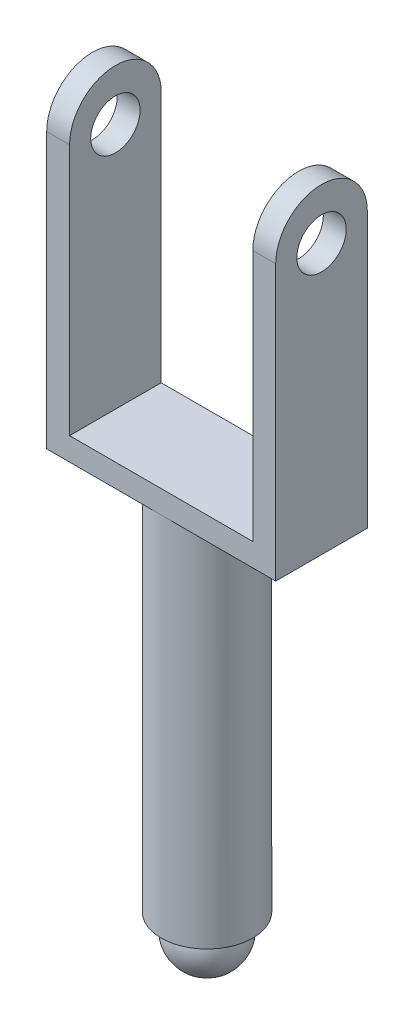
ISO-10303-21;
HEADER;
FILE_DESCRIPTION(('STEP AP214'),'2;1');
FILE_NAME('part.step','',(''),(''),'','','');
FILE_SCHEMA(('AUTOMOTIVE_DESIGN { 1 0 10303 214 1 1 1 1 }'));
ENDSEC;
DATA;
#1=APPLICATION_CONTEXT('core data for automotive mechanical design processes');
#2=APPLICATION_PROTOCOL_DEFINITION('international standard','automotive_design',2000,#1);
#3=PRODUCT_CONTEXT('',#1,'mechanical');
#4=PRODUCT('Part','Part','',(#3));
#5=PRODUCT_RELATED_PRODUCT_CATEGORY('part','',(#4));
#6=PRODUCT_DEFINITION_FORMATION('','',#4);
#7=PRODUCT_DEFINITION_CONTEXT('part definition',#1,'design');
#8=PRODUCT_DEFINITION('design','',#6,#7);
#9=PRODUCT_DEFINITION_SHAPE('','',#8);
#10=(LENGTH_UNIT() NAMED_UNIT(*) SI_UNIT(.MILLI.,.METRE.));
#11=(NAMED_UNIT(*) PLANE_ANGLE_UNIT() SI_UNIT($,.RADIAN.));
#12=(NAMED_UNIT(*) SI_UNIT($,.STERADIAN.) SOLID_ANGLE_UNIT());
#13=UNCERTAINTY_MEASURE_WITH_UNIT(LENGTH_MEASURE(1.E-05),#10,'distance_accuracy_value','');
#14=(GEOMETRIC_REPRESENTATION_CONTEXT(3) GLOBAL_UNCERTAINTY_ASSIGNED_CONTEXT((#13)) GLOBAL_UNIT_ASSIGNED_CONTEXT((#10,
#11,#12)) REPRESENTATION_CONTEXT('',''));
#15=CARTESIAN_POINT('',(0.,0.,0.));
#16=DIRECTION('',(0.,0.,1.));
#17=DIRECTION('',(1.,0.,0.));
#18=AXIS2_PLACEMENT_3D('',#15,#16,#17);
#19=CARTESIAN_POINT('',(25.,140.,0.));
#20=DIRECTION('',(1.,0.,0.));
#21=DIRECTION('',(0.,0.,-1.));
#22=AXIS2_PLACEMENT_3D('',#19,#20,#21);
#23=CYLINDRICAL_SURFACE('',#22,10.);
#24=DIRECTION('',(-1.,0.,0.));
#25=VECTOR('',#24,1.);
#26=CARTESIAN_POINT('',(25.,140.,10.));
#27=LINE('',#26,#25);
#28=CARTESIAN_POINT('',(25.,140.,10.));
#29=VERTEX_POINT('',#28);
#30=CARTESIAN_POINT('',(20.,140.,10.));
#31=VERTEX_POINT('',#30);
#32=EDGE_CURVE('E186',#29,#31,#27,.T.);
#33=ORIENTED_EDGE('',*,*,#32,.F.);
#34=CARTESIAN_POINT('',(25.,140.,0.));
#35=DIRECTION('',(-1.,0.,0.));
#36=DIRECTION('',(0.,0.,1.));
#37=AXIS2_PLACEMENT_3D('',#34,#35,#36);
#38=CIRCLE('',#37,10.);
#39=CARTESIAN_POINT('',(25.,140.,-10.));
#40=VERTEX_POINT('',#39);
#41=EDGE_CURVE('E52',#40,#29,#38,.F.);
#42=ORIENTED_EDGE('',*,*,#41,.F.);
#43=DIRECTION('',(-1.,0.,0.));
#44=VECTOR('',#43,1.);
#45=CARTESIAN_POINT('',(25.,140.,-10.));
#46=LINE('',#45,#44);
#47=CARTESIAN_POINT('',(20.,140.,-10.));
#48=VERTEX_POINT('',#47);
#49=EDGE_CURVE('E188',#48,#40,#46,.F.);
#50=ORIENTED_EDGE('',*,*,#49,.F.);
#51=CARTESIAN_POINT('',(20.,140.,0.));
#52=DIRECTION('',(1.,0.,0.));
#53=DIRECTION('',(0.,0.,-1.));
#54=AXIS2_PLACEMENT_3D('',#51,#52,#53);
#55=CIRCLE('',#54,10.);
#56=EDGE_CURVE('E45',#31,#48,#55,.F.);
#57=ORIENTED_EDGE('',*,*,#56,.F.);
#58=EDGE_LOOP('',(#33,#42,#50,#57));
#59=FACE_BOUND('',#58,.T.);
#60=ADVANCED_FACE('F37',(#59),#23,.T.);
#61=CARTESIAN_POINT('',(-20.,140.,0.));
#62=DIRECTION('',(1.,0.,0.));
#63=DIRECTION('',(0.,0.,-1.));
#64=AXIS2_PLACEMENT_3D('',#61,#62,#63);
#65=CYLINDRICAL_SURFACE('',#64,10.);
#66=DIRECTION('',(-1.,0.,0.));
#67=VECTOR('',#66,1.);
#68=CARTESIAN_POINT('',(-20.,140.,10.));
#69=LINE('',#68,#67);
#70=CARTESIAN_POINT('',(-20.,140.,10.));
#71=VERTEX_POINT('',#70);
#72=CARTESIAN_POINT('',(-25.,140.,10.));
#73=VERTEX_POINT('',#72);
#74=EDGE_CURVE('E171',#71,#73,#69,.T.);
#75=ORIENTED_EDGE('',*,*,#74,.F.);
#76=CARTESIAN_POINT('',(-20.,140.,0.));
#77=DIRECTION('',(-1.,0.,0.));
#78=DIRECTION('',(0.,0.,1.));
#79=AXIS2_PLACEMENT_3D('',#76,#77,#78);
#80=CIRCLE('',#79,10.);
#81=CARTESIAN_POINT('',(-20.,140.,-10.));
#82=VERTEX_POINT('',#81);
#83=EDGE_CURVE('E112',#82,#71,#80,.F.);
#84=ORIENTED_EDGE('',*,*,#83,.F.);
#85=DIRECTION('',(-1.,0.,0.));
#86=VECTOR('',#85,1.);
#87=CARTESIAN_POINT('',(-20.,140.,-10.));
#88=LINE('',#87,#86);
#89=CARTESIAN_POINT('',(-25.,140.,-10.));
#90=VERTEX_POINT('',#89);
#91=EDGE_CURVE('E180',#90,#82,#88,.F.);
#92=ORIENTED_EDGE('',*,*,#91,.F.);
#93=CARTESIAN_POINT('',(-25.,140.,0.));
#94=DIRECTION('',(1.,0.,0.));
#95=DIRECTION('',(0.,0.,-1.));
#96=AXIS2_PLACEMENT_3D('',#93,#94,#95);
#97=CIRCLE('',#96,10.);
#98=EDGE_CURVE('E184',#73,#90,#97,.F.);
#99=ORIENTED_EDGE('',*,*,#98,.F.);
#100=EDGE_LOOP('',(#75,#84,#92,#99));
#101=FACE_BOUND('',#100,.T.);
#102=ADVANCED_FACE('F219',(#101),#65,.T.);
#103=CARTESIAN_POINT('',(0.,0.,0.));
#104=DIRECTION('',(0.,1.,0.));
#105=DIRECTION('',(0.,0.,1.));
#106=AXIS2_PLACEMENT_3D('',#103,#104,#105);
#107=PLANE('',#106);
#108=CARTESIAN_POINT('',(0.,0.,0.));
#109=DIRECTION('',(0.,1.,0.));
#110=DIRECTION('',(0.,0.,1.));
#111=AXIS2_PLACEMENT_3D('',#108,#109,#110);
#112=CIRCLE('',#111,6.69096906430917);
#113=CARTESIAN_POINT('',(0.,0.,6.69096906430917));
#114=VERTEX_POINT('',#113);
#115=EDGE_CURVE('E11',#114,#114,#112,.F.);
#116=ORIENTED_EDGE('',*,*,#115,.F.);
#117=EDGE_LOOP('',(#116));
#118=FACE_BOUND('',#117,.T.);
#119=CARTESIAN_POINT('',(0.,0.,0.));
#120=DIRECTION('',(0.,1.,0.));
#121=DIRECTION('',(0.,0.,1.));
#122=AXIS2_PLACEMENT_3D('',#119,#120,#121);
#123=CIRCLE('',#122,10.);
#124=CARTESIAN_POINT('',(0.,0.,10.));
#125=VERTEX_POINT('',#124);
#126=EDGE_CURVE('E167',#125,#125,#123,.T.);
#127=ORIENTED_EDGE('',*,*,#126,.F.);
#128=EDGE_LOOP('',(#127));
#129=FACE_BOUND('',#128,.T.);
#130=ADVANCED_FACE('F223',(#118,#129),#107,.F.);
#131=CARTESIAN_POINT('',(0.,80.,0.));
#132=DIRECTION('',(0.,-1.,0.));
#133=DIRECTION('',(0.,0.,-1.));
#134=AXIS2_PLACEMENT_3D('',#131,#132,#133);
#135=CYLINDRICAL_SURFACE('',#134,10.);
#136=CARTESIAN_POINT('',(0.,80.,0.));
#137=DIRECTION('',(0.,1.,0.));
#138=DIRECTION('',(0.,0.,1.));
#139=AXIS2_PLACEMENT_3D('',#136,#137,#138);
#140=CIRCLE('',#139,10.);
#141=CARTESIAN_POINT('',(0.,80.,10.));
#142=VERTEX_POINT('',#141);
#143=CARTESIAN_POINT('',(0.,80.,-10.));
#144=VERTEX_POINT('',#143);
#145=EDGE_CURVE('E168',#142,#144,#140,.T.);
#146=ORIENTED_EDGE('',*,*,#145,.F.);
#147=EDGE_CURVE('E172',#144,#142,#140,.T.);
#148=ORIENTED_EDGE('',*,*,#147,.F.);
#149=EDGE_LOOP('',(#146,#148));
#150=FACE_BOUND('',#149,.T.);
#151=ORIENTED_EDGE('',*,*,#126,.T.);
#152=EDGE_LOOP('',(#151));
#153=FACE_BOUND('',#152,.T.);
#154=ADVANCED_FACE('F228',(#150,#153),#135,.T.);
#155=CARTESIAN_POINT('',(0.,80.,0.));
#156=DIRECTION('',(0.,1.,0.));
#157=DIRECTION('',(0.,0.,1.));
#158=AXIS2_PLACEMENT_3D('',#155,#156,#157);
#159=PLANE('',#158);
#160=DIRECTION('',(1.,0.,0.));
#161=VECTOR('',#160,1.);
#162=CARTESIAN_POINT('',(-25.,80.,10.));
#163=LINE('',#162,#161);
#164=CARTESIAN_POINT('',(25.,80.,10.));
#165=VERTEX_POINT('',#164);
#166=EDGE_CURVE('E155',#142,#165,#163,.T.);
#167=ORIENTED_EDGE('',*,*,#166,.F.);
#168=ORIENTED_EDGE('',*,*,#145,.T.);
#169=DIRECTION('',(-1.,0.,0.));
#170=VECTOR('',#169,1.);
#171=CARTESIAN_POINT('',(-25.,80.,-10.));
#172=LINE('',#171,#170);
#173=CARTESIAN_POINT('',(25.,80.,-10.));
#174=VERTEX_POINT('',#173);
#175=EDGE_CURVE('E149',#174,#144,#172,.T.);
#176=ORIENTED_EDGE('',*,*,#175,.F.);
#177=DIRECTION('',(0.,0.,-1.));
#178=VECTOR('',#177,1.);
#179=CARTESIAN_POINT('',(25.,80.,-10.));
#180=LINE('',#179,#178);
#181=EDGE_CURVE('E141',#165,#174,#180,.T.);
#182=ORIENTED_EDGE('',*,*,#181,.F.);
#183=EDGE_LOOP('',(#167,#168,#176,#182));
#184=FACE_BOUND('',#183,.T.);
#185=ADVANCED_FACE('F199',(#184),#159,.F.);
#186=CARTESIAN_POINT('',(-25.,80.,-10.));
#187=VERTEX_POINT('',#186);
#188=EDGE_CURVE('E148',#144,#187,#172,.T.);
#189=ORIENTED_EDGE('',*,*,#188,.F.);
#190=ORIENTED_EDGE('',*,*,#147,.T.);
#191=CARTESIAN_POINT('',(-25.,80.,10.));
#192=VERTEX_POINT('',#191);
#193=EDGE_CURVE('E156',#192,#142,#163,.T.);
#194=ORIENTED_EDGE('',*,*,#193,.F.);
#195=DIRECTION('',(0.,0.,1.));
#196=VECTOR('',#195,1.);
#197=CARTESIAN_POINT('',(-25.,80.,-10.));
#198=LINE('',#197,#196);
#199=EDGE_CURVE('E152',#187,#192,#198,.T.);
#200=ORIENTED_EDGE('',*,*,#199,.F.);
#201=EDGE_LOOP('',(#189,#190,#194,#200));
#202=FACE_BOUND('',#201,.T.);
#203=ADVANCED_FACE('F240',(#202),#159,.F.);
#204=CARTESIAN_POINT('',(25.,150.,-10.));
#205=DIRECTION('',(-1.,0.,0.));
#206=DIRECTION('',(0.,0.,1.));
#207=AXIS2_PLACEMENT_3D('',#204,#205,#206);
#208=PLANE('',#207);
#209=CARTESIAN_POINT('',(25.,138.858219844535,0.));
#210=DIRECTION('',(-1.,0.,0.));
#211=DIRECTION('',(0.,0.,1.));
#212=AXIS2_PLACEMENT_3D('',#209,#210,#211);
#213=CIRCLE('',#212,5.39381875274195);
#214=CARTESIAN_POINT('',(25.,138.858219844535,5.39381875274195));
#215=VERTEX_POINT('',#214);
#216=EDGE_CURVE('E178',#215,#215,#213,.T.);
#217=ORIENTED_EDGE('',*,*,#216,.T.);
#218=EDGE_LOOP('',(#217));
#219=FACE_BOUND('',#218,.T.);
#220=DIRECTION('',(0.,-1.,0.));
#221=VECTOR('',#220,1.);
#222=CARTESIAN_POINT('',(25.,150.,-10.));
#223=LINE('',#222,#221);
#224=EDGE_CURVE('E165',#40,#174,#223,.T.);
#225=ORIENTED_EDGE('',*,*,#224,.F.);
#226=ORIENTED_EDGE('',*,*,#41,.T.);
#227=DIRECTION('',(0.,-1.,0.));
#228=VECTOR('',#227,1.);
#229=CARTESIAN_POINT('',(25.,150.,10.));
#230=LINE('',#229,#228);
#231=EDGE_CURVE('E159',#29,#165,#230,.T.);
#232=ORIENTED_EDGE('',*,*,#231,.T.);
#233=ORIENTED_EDGE('',*,*,#181,.T.);
#234=EDGE_LOOP('',(#225,#226,#232,#233));
#235=FACE_BOUND('',#234,.T.);
#236=ADVANCED_FACE('F192',(#219,#235),#208,.F.);
#237=CARTESIAN_POINT('',(-25.,150.,-10.));
#238=DIRECTION('',(0.,0.,1.));
#239=DIRECTION('',(1.,0.,0.));
#240=AXIS2_PLACEMENT_3D('',#237,#238,#239);
#241=PLANE('',#240);
#242=DIRECTION('',(0.,1.,0.));
#243=VECTOR('',#242,1.);
#244=CARTESIAN_POINT('',(20.,85.,-10.));
#245=LINE('',#244,#243);
#246=CARTESIAN_POINT('',(20.,85.,-10.));
#247=VERTEX_POINT('',#246);
#248=EDGE_CURVE('E142',#247,#48,#245,.T.);
#249=ORIENTED_EDGE('',*,*,#248,.T.);
#250=ORIENTED_EDGE('',*,*,#49,.T.);
#251=ORIENTED_EDGE('',*,*,#224,.T.);
#252=ORIENTED_EDGE('',*,*,#175,.T.);
#253=ORIENTED_EDGE('',*,*,#188,.T.);
#254=DIRECTION('',(0.,-1.,0.));
#255=VECTOR('',#254,1.);
#256=CARTESIAN_POINT('',(-25.,150.,-10.));
#257=LINE('',#256,#255);
#258=EDGE_CURVE('E163',#90,#187,#257,.T.);
#259=ORIENTED_EDGE('',*,*,#258,.F.);
#260=ORIENTED_EDGE('',*,*,#91,.T.);
#261=DIRECTION('',(0.,1.,0.));
#262=VECTOR('',#261,1.);
#263=CARTESIAN_POINT('',(-20.,85.,-10.));
#264=LINE('',#263,#262);
#265=CARTESIAN_POINT('',(-20.,85.,-10.));
#266=VERTEX_POINT('',#265);
#267=EDGE_CURVE('E139',#266,#82,#264,.T.);
#268=ORIENTED_EDGE('',*,*,#267,.F.);
#269=DIRECTION('',(-1.,0.,0.));
#270=VECTOR('',#269,1.);
#271=CARTESIAN_POINT('',(-20.,85.,-10.));
#272=LINE('',#271,#270);
#273=EDGE_CURVE('E118',#247,#266,#272,.T.);
#274=ORIENTED_EDGE('',*,*,#273,.F.);
#275=EDGE_LOOP('',(#249,#250,#251,#252,#253,#259,#260,#268,#274));
#276=FACE_BOUND('',#275,.T.);
#277=ADVANCED_FACE('F203',(#276),#241,.F.);
#278=CARTESIAN_POINT('',(-25.,150.,-10.));
#279=DIRECTION('',(1.,0.,0.));
#280=DIRECTION('',(0.,0.,-1.));
#281=AXIS2_PLACEMENT_3D('',#278,#279,#280);
#282=PLANE('',#281);
#283=CARTESIAN_POINT('',(-25.,138.858219844535,0.));
#284=DIRECTION('',(-1.,0.,0.));
#285=DIRECTION('',(0.,0.,1.));
#286=AXIS2_PLACEMENT_3D('',#283,#284,#285);
#287=CIRCLE('',#286,5.39381875274195);
#288=CARTESIAN_POINT('',(-25.,138.858219844535,5.39381875274195));
#289=VERTEX_POINT('',#288);
#290=EDGE_CURVE('E346',#289,#289,#287,.T.);
#291=ORIENTED_EDGE('',*,*,#290,.F.);
#292=EDGE_LOOP('',(#291));
#293=FACE_BOUND('',#292,.T.);
#294=DIRECTION('',(0.,-1.,0.));
#295=VECTOR('',#294,1.);
#296=CARTESIAN_POINT('',(-25.,150.,10.));
#297=LINE('',#296,#295);
#298=EDGE_CURVE('E161',#73,#192,#297,.T.);
#299=ORIENTED_EDGE('',*,*,#298,.F.);
#300=ORIENTED_EDGE('',*,*,#98,.T.);
#301=ORIENTED_EDGE('',*,*,#258,.T.);
#302=ORIENTED_EDGE('',*,*,#199,.T.);
#303=EDGE_LOOP('',(#299,#300,#301,#302));
#304=FACE_BOUND('',#303,.T.);
#305=ADVANCED_FACE('F244',(#293,#304),#282,.F.);
#306=CARTESIAN_POINT('',(-25.,150.,10.));
#307=DIRECTION('',(0.,0.,-1.));
#308=DIRECTION('',(-1.,0.,0.));
#309=AXIS2_PLACEMENT_3D('',#306,#307,#308);
#310=PLANE('',#309);
#311=ORIENTED_EDGE('',*,*,#231,.F.);
#312=ORIENTED_EDGE('',*,*,#32,.T.);
#313=DIRECTION('',(0.,1.,0.));
#314=VECTOR('',#313,1.);
#315=CARTESIAN_POINT('',(20.,85.,10.));
#316=LINE('',#315,#314);
#317=CARTESIAN_POINT('',(20.,85.,10.));
#318=VERTEX_POINT('',#317);
#319=EDGE_CURVE('E117',#318,#31,#316,.T.);
#320=ORIENTED_EDGE('',*,*,#319,.F.);
#321=DIRECTION('',(1.,0.,0.));
#322=VECTOR('',#321,1.);
#323=CARTESIAN_POINT('',(-20.,85.,10.));
#324=LINE('',#323,#322);
#325=CARTESIAN_POINT('',(-20.,85.,10.));
#326=VERTEX_POINT('',#325);
#327=EDGE_CURVE('E124',#326,#318,#324,.T.);
#328=ORIENTED_EDGE('',*,*,#327,.F.);
#329=DIRECTION('',(0.,1.,0.));
#330=VECTOR('',#329,1.);
#331=CARTESIAN_POINT('',(-20.,85.,10.));
#332=LINE('',#331,#330);
#333=EDGE_CURVE('E106',#326,#71,#332,.T.);
#334=ORIENTED_EDGE('',*,*,#333,.T.);
#335=ORIENTED_EDGE('',*,*,#74,.T.);
#336=ORIENTED_EDGE('',*,*,#298,.T.);
#337=ORIENTED_EDGE('',*,*,#193,.T.);
#338=ORIENTED_EDGE('',*,*,#166,.T.);
#339=EDGE_LOOP('',(#311,#312,#320,#328,#334,#335,#336,#337,#338));
#340=FACE_BOUND('',#339,.T.);
#341=ADVANCED_FACE('F131',(#340),#310,.F.);
#342=CARTESIAN_POINT('',(-20.,85.,-10.));
#343=DIRECTION('',(-1.,0.,0.));
#344=DIRECTION('',(0.,0.,1.));
#345=AXIS2_PLACEMENT_3D('',#342,#343,#344);
#346=PLANE('',#345);
#347=CARTESIAN_POINT('',(-20.,138.858219844535,0.));
#348=DIRECTION('',(-1.,0.,0.));
#349=DIRECTION('',(0.,0.,1.));
#350=AXIS2_PLACEMENT_3D('',#347,#348,#349);
#351=CIRCLE('',#350,5.39381875274195);
#352=CARTESIAN_POINT('',(-20.,138.858219844535,5.39381875274195));
#353=VERTEX_POINT('',#352);
#354=EDGE_CURVE('E128',#353,#353,#351,.T.);
#355=ORIENTED_EDGE('',*,*,#354,.T.);
#356=EDGE_LOOP('',(#355));
#357=FACE_BOUND('',#356,.T.);
#358=ORIENTED_EDGE('',*,*,#267,.T.);
#359=ORIENTED_EDGE('',*,*,#83,.T.);
#360=ORIENTED_EDGE('',*,*,#333,.F.);
#361=DIRECTION('',(0.,0.,1.));
#362=VECTOR('',#361,1.);
#363=CARTESIAN_POINT('',(-20.,85.,-10.));
#364=LINE('',#363,#362);
#365=EDGE_CURVE('E110',#266,#326,#364,.T.);
#366=ORIENTED_EDGE('',*,*,#365,.F.);
#367=EDGE_LOOP('',(#358,#359,#360,#366));
#368=FACE_BOUND('',#367,.T.);
#369=ADVANCED_FACE('F109',(#357,#368),#346,.F.);
#370=CARTESIAN_POINT('',(20.,85.,-10.));
#371=DIRECTION('',(1.,0.,0.));
#372=DIRECTION('',(0.,0.,-1.));
#373=AXIS2_PLACEMENT_3D('',#370,#371,#372);
#374=PLANE('',#373);
#375=CARTESIAN_POINT('',(20.,138.858219844535,0.));
#376=DIRECTION('',(1.,0.,0.));
#377=DIRECTION('',(0.,0.,-1.));
#378=AXIS2_PLACEMENT_3D('',#375,#376,#377);
#379=CIRCLE('',#378,5.39381875274195);
#380=CARTESIAN_POINT('',(20.,138.858219844535,-5.39381875274195));
#381=VERTEX_POINT('',#380);
#382=EDGE_CURVE('E175',#381,#381,#379,.T.);
#383=ORIENTED_EDGE('',*,*,#382,.T.);
#384=EDGE_LOOP('',(#383));
#385=FACE_BOUND('',#384,.T.);
#386=ORIENTED_EDGE('',*,*,#319,.T.);
#387=ORIENTED_EDGE('',*,*,#56,.T.);
#388=ORIENTED_EDGE('',*,*,#248,.F.);
#389=DIRECTION('',(0.,0.,-1.));
#390=VECTOR('',#389,1.);
#391=CARTESIAN_POINT('',(20.,85.,-10.));
#392=LINE('',#391,#390);
#393=EDGE_CURVE('E133',#318,#247,#392,.T.);
#394=ORIENTED_EDGE('',*,*,#393,.F.);
#395=EDGE_LOOP('',(#386,#387,#388,#394));
#396=FACE_BOUND('',#395,.T.);
#397=ADVANCED_FACE('F206',(#385,#396),#374,.F.);
#398=CARTESIAN_POINT('',(0.,85.,0.));
#399=DIRECTION('',(0.,1.,0.));
#400=DIRECTION('',(0.,0.,1.));
#401=AXIS2_PLACEMENT_3D('',#398,#399,#400);
#402=PLANE('',#401);
#403=ORIENTED_EDGE('',*,*,#365,.T.);
#404=ORIENTED_EDGE('',*,*,#327,.T.);
#405=ORIENTED_EDGE('',*,*,#393,.T.);
#406=ORIENTED_EDGE('',*,*,#273,.T.);
#407=EDGE_LOOP('',(#403,#404,#405,#406));
#408=FACE_BOUND('',#407,.T.);
#409=ADVANCED_FACE('F122',(#408),#402,.T.);
#410=CARTESIAN_POINT('',(25.,138.858219844535,0.));
#411=DIRECTION('',(-1.,0.,0.));
#412=DIRECTION('',(0.,0.,1.));
#413=AXIS2_PLACEMENT_3D('',#410,#411,#412);
#414=CYLINDRICAL_SURFACE('',#413,5.39381875274195);
#415=ORIENTED_EDGE('',*,*,#216,.F.);
#416=EDGE_LOOP('',(#415));
#417=FACE_BOUND('',#416,.T.);
#418=ORIENTED_EDGE('',*,*,#382,.F.);
#419=EDGE_LOOP('',(#418));
#420=FACE_BOUND('',#419,.T.);
#421=ADVANCED_FACE('F214',(#417,#420),#414,.F.);
#422=ORIENTED_EDGE('',*,*,#290,.T.);
#423=EDGE_LOOP('',(#422));
#424=FACE_BOUND('',#423,.T.);
#425=ORIENTED_EDGE('',*,*,#354,.F.);
#426=EDGE_LOOP('',(#425));
#427=FACE_BOUND('',#426,.T.);
#428=ADVANCED_FACE('F313',(#424,#427),#414,.F.);
#429=CARTESIAN_POINT('',(0.,-3.38835254666006,0.));
#430=DIRECTION('',(0.,1.,0.));
#431=DIRECTION('',(-1.,0.,0.));
#432=AXIS2_PLACEMENT_3D('',#429,#430,#431);
#433=SPHERICAL_SURFACE('',#432,7.5);
#434=ORIENTED_EDGE('',*,*,#115,.T.);
#435=EDGE_LOOP('',(#434));
#436=FACE_BOUND('',#435,.T.);
#437=ADVANCED_FACE('F309',(#436),#433,.T.);
#438=CLOSED_SHELL('',(#60,#102,#130,#154,#185,#203,#236,#277,#305,#341,#369,#397,#409,#421,#428,#437));
#439=MANIFOLD_SOLID_BREP('B2',#438);
#440=ADVANCED_BREP_SHAPE_REPRESENTATION('',(#18,#439),#14);
#441=SHAPE_DEFINITION_REPRESENTATION(#9,#440);
ENDSEC;
END-ISO-10303-21;
